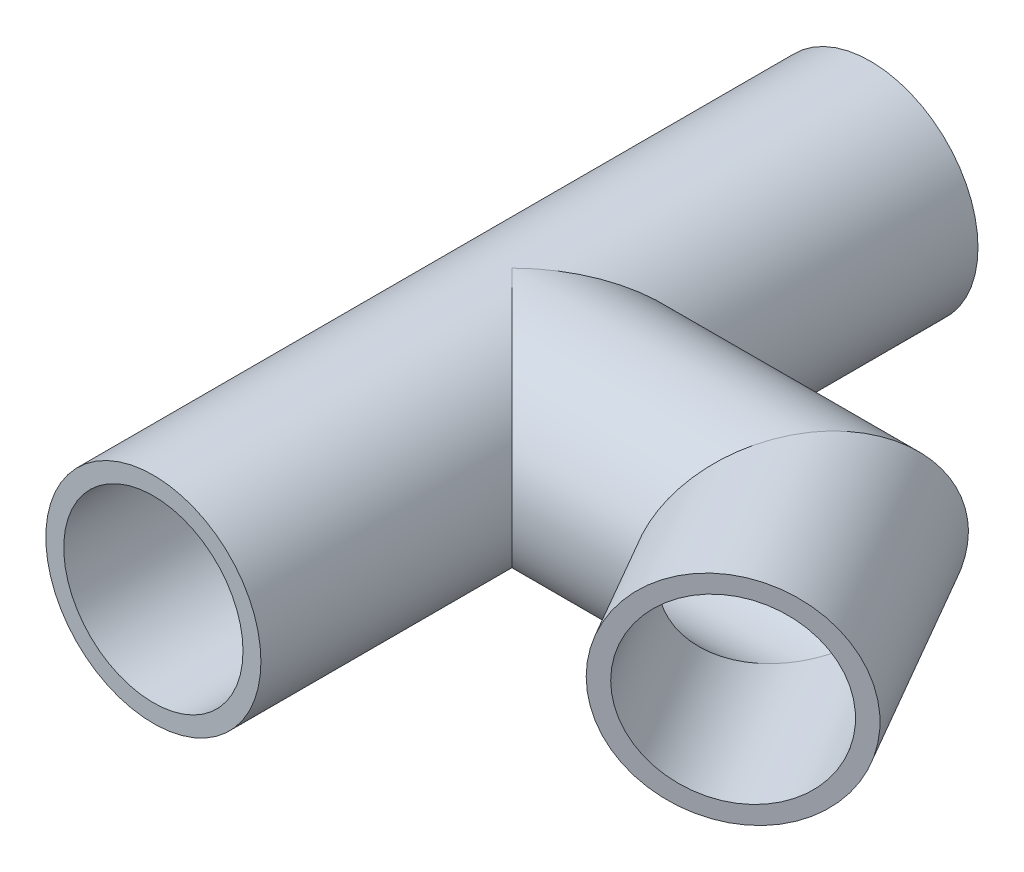
ISO-10303-21;
HEADER;
FILE_DESCRIPTION(('STEP AP214'),'2;1');
FILE_NAME('part.step','',(''),(''),'','','');
FILE_SCHEMA(('AUTOMOTIVE_DESIGN { 1 0 10303 214 1 1 1 1 }'));
ENDSEC;
DATA;
#1=APPLICATION_CONTEXT('core data for automotive mechanical design processes');
#2=APPLICATION_PROTOCOL_DEFINITION('international standard','automotive_design',2000,#1);
#3=PRODUCT_CONTEXT('',#1,'mechanical');
#4=PRODUCT('Part','Part','',(#3));
#5=PRODUCT_RELATED_PRODUCT_CATEGORY('part','',(#4));
#6=PRODUCT_DEFINITION_FORMATION('','',#4);
#7=PRODUCT_DEFINITION_CONTEXT('part definition',#1,'design');
#8=PRODUCT_DEFINITION('design','',#6,#7);
#9=PRODUCT_DEFINITION_SHAPE('','',#8);
#10=(LENGTH_UNIT() NAMED_UNIT(*) SI_UNIT(.MILLI.,.METRE.));
#11=(NAMED_UNIT(*) PLANE_ANGLE_UNIT() SI_UNIT($,.RADIAN.));
#12=(NAMED_UNIT(*) SI_UNIT($,.STERADIAN.) SOLID_ANGLE_UNIT());
#13=UNCERTAINTY_MEASURE_WITH_UNIT(LENGTH_MEASURE(1.E-05),#10,'distance_accuracy_value','');
#14=(GEOMETRIC_REPRESENTATION_CONTEXT(3) GLOBAL_UNCERTAINTY_ASSIGNED_CONTEXT((#13)) GLOBAL_UNIT_ASSIGNED_CONTEXT((#10,
#11,#12)) REPRESENTATION_CONTEXT('',''));
#15=CARTESIAN_POINT('',(0.,0.,0.));
#16=DIRECTION('',(0.,0.,1.));
#17=DIRECTION('',(1.,0.,0.));
#18=AXIS2_PLACEMENT_3D('',#15,#16,#17);
#19=CARTESIAN_POINT('',(0.,0.,20.));
#20=DIRECTION('',(0.,0.,-1.));
#21=DIRECTION('',(-1.,0.,0.));
#22=AXIS2_PLACEMENT_3D('',#19,#20,#21);
#23=CYLINDRICAL_SURFACE('',#22,3.);
#24=CARTESIAN_POINT('',(0.,0.,10.));
#25=DIRECTION('',(-0.707106781186547,0.,0.707106781186547));
#26=DIRECTION('',(-0.707106781186547,0.,-0.707106781186547));
#27=AXIS2_PLACEMENT_3D('',#24,#25,#26);
#28=ELLIPSE('',#27,4.24264068711929,3.);
#29=CARTESIAN_POINT('',(0.,3.,10.));
#30=VERTEX_POINT('',#29);
#31=CARTESIAN_POINT('',(0.,-3.,10.));
#32=VERTEX_POINT('',#31);
#33=EDGE_CURVE('E50',#30,#32,#28,.F.);
#34=ORIENTED_EDGE('',*,*,#33,.F.);
#35=CARTESIAN_POINT('',(0.,0.,10.));
#36=DIRECTION('',(-0.707106781186547,0.,-0.707106781186547));
#37=DIRECTION('',(-0.707106781186547,0.,0.707106781186547));
#38=AXIS2_PLACEMENT_3D('',#35,#36,#37);
#39=ELLIPSE('',#38,4.24264068711929,3.);
#40=EDGE_CURVE('E46',#32,#30,#39,.F.);
#41=ORIENTED_EDGE('',*,*,#40,.F.);
#42=EDGE_LOOP('',(#34,#41));
#43=FACE_BOUND('',#42,.T.);
#44=CARTESIAN_POINT('',(0.,0.,20.));
#45=DIRECTION('',(0.,0.,1.));
#46=DIRECTION('',(1.,0.,0.));
#47=AXIS2_PLACEMENT_3D('',#44,#45,#46);
#48=CIRCLE('',#47,3.);
#49=CARTESIAN_POINT('',(3.,0.,20.));
#50=VERTEX_POINT('',#49);
#51=EDGE_CURVE('E11',#50,#50,#48,.T.);
#52=ORIENTED_EDGE('',*,*,#51,.F.);
#53=EDGE_LOOP('',(#52));
#54=FACE_BOUND('',#53,.T.);
#55=CARTESIAN_POINT('',(0.,0.,0.));
#56=DIRECTION('',(0.,0.,1.));
#57=DIRECTION('',(1.,0.,0.));
#58=AXIS2_PLACEMENT_3D('',#55,#56,#57);
#59=CIRCLE('',#58,3.);
#60=CARTESIAN_POINT('',(3.,0.,0.));
#61=VERTEX_POINT('',#60);
#62=EDGE_CURVE('E36',#61,#61,#59,.T.);
#63=ORIENTED_EDGE('',*,*,#62,.T.);
#64=EDGE_LOOP('',(#63));
#65=FACE_BOUND('',#64,.T.);
#66=ADVANCED_FACE('F32',(#43,#54,#65),#23,.T.);
#67=CARTESIAN_POINT('',(0.,0.,20.));
#68=DIRECTION('',(0.,0.,1.));
#69=DIRECTION('',(1.,0.,0.));
#70=AXIS2_PLACEMENT_3D('',#67,#68,#69);
#71=PLANE('',#70);
#72=ORIENTED_EDGE('',*,*,#51,.T.);
#73=EDGE_LOOP('',(#72));
#74=FACE_BOUND('',#73,.T.);
#75=CARTESIAN_POINT('',(0.,0.,20.));
#76=DIRECTION('',(0.,0.,1.));
#77=DIRECTION('',(1.,0.,0.));
#78=AXIS2_PLACEMENT_3D('',#75,#76,#77);
#79=CIRCLE('',#78,2.5);
#80=CARTESIAN_POINT('',(2.5,0.,20.));
#81=VERTEX_POINT('',#80);
#82=EDGE_CURVE('E71',#81,#81,#79,.T.);
#83=ORIENTED_EDGE('',*,*,#82,.F.);
#84=EDGE_LOOP('',(#83));
#85=FACE_BOUND('',#84,.T.);
#86=ADVANCED_FACE('F118',(#74,#85),#71,.T.);
#87=CARTESIAN_POINT('',(0.,0.,0.));
#88=DIRECTION('',(0.,0.,1.));
#89=DIRECTION('',(1.,0.,0.));
#90=AXIS2_PLACEMENT_3D('',#87,#88,#89);
#91=PLANE('',#90);
#92=ORIENTED_EDGE('',*,*,#62,.F.);
#93=EDGE_LOOP('',(#92));
#94=FACE_BOUND('',#93,.T.);
#95=CARTESIAN_POINT('',(0.,0.,0.));
#96=DIRECTION('',(0.,0.,1.));
#97=DIRECTION('',(1.,0.,0.));
#98=AXIS2_PLACEMENT_3D('',#95,#96,#97);
#99=CIRCLE('',#98,2.5);
#100=CARTESIAN_POINT('',(2.5,0.,0.));
#101=VERTEX_POINT('',#100);
#102=EDGE_CURVE('E67',#101,#101,#99,.T.);
#103=ORIENTED_EDGE('',*,*,#102,.T.);
#104=EDGE_LOOP('',(#103));
#105=FACE_BOUND('',#104,.T.);
#106=ADVANCED_FACE('F123',(#94,#105),#91,.F.);
#107=CARTESIAN_POINT('',(0.,0.,20.));
#108=DIRECTION('',(0.,0.,-1.));
#109=DIRECTION('',(-1.,0.,0.));
#110=AXIS2_PLACEMENT_3D('',#107,#108,#109);
#111=CYLINDRICAL_SURFACE('',#110,2.5);
#112=ORIENTED_EDGE('',*,*,#82,.T.);
#113=EDGE_LOOP('',(#112));
#114=FACE_BOUND('',#113,.T.);
#115=ORIENTED_EDGE('',*,*,#102,.F.);
#116=EDGE_LOOP('',(#115));
#117=FACE_BOUND('',#116,.T.);
#118=ADVANCED_FACE('F101',(#114,#117),#111,.F.);
#119=CARTESIAN_POINT('',(10.0052558883258,0.,10.));
#120=DIRECTION('',(-1.,0.,0.));
#121=DIRECTION('',(0.,0.,1.));
#122=AXIS2_PLACEMENT_3D('',#119,#120,#121);
#123=CYLINDRICAL_SURFACE('',#122,3.);
#124=CARTESIAN_POINT('',(8.,0.,10.));
#125=DIRECTION('',(-0.866025403784438,0.,-0.500000000000001));
#126=DIRECTION('',(0.500000000000001,0.,-0.866025403784438));
#127=AXIS2_PLACEMENT_3D('',#124,#125,#126);
#128=ELLIPSE('',#127,3.46410161513776,3.);
#129=CARTESIAN_POINT('',(9.73205080756888,0.,7.));
#130=VERTEX_POINT('',#129);
#131=EDGE_CURVE('E74',#130,#130,#128,.F.);
#132=ORIENTED_EDGE('',*,*,#131,.F.);
#133=EDGE_LOOP('',(#132));
#134=FACE_BOUND('',#133,.T.);
#135=ORIENTED_EDGE('',*,*,#33,.T.);
#136=ORIENTED_EDGE('',*,*,#40,.T.);
#137=EDGE_LOOP('',(#135,#136));
#138=FACE_BOUND('',#137,.T.);
#139=ADVANCED_FACE('F97',(#134,#138),#123,.T.);
#140=CARTESIAN_POINT('',(9.68771324027147,0.,10.));
#141=DIRECTION('',(-1.,0.,0.));
#142=DIRECTION('',(0.,0.,1.));
#143=AXIS2_PLACEMENT_3D('',#140,#141,#142);
#144=CYLINDRICAL_SURFACE('',#143,2.5);
#145=CARTESIAN_POINT('',(8.,0.,10.));
#146=DIRECTION('',(-0.866025403784438,0.,-0.500000000000001));
#147=DIRECTION('',(0.500000000000001,0.,-0.866025403784438));
#148=AXIS2_PLACEMENT_3D('',#145,#146,#147);
#149=ELLIPSE('',#148,2.88675134594813,2.5);
#150=CARTESIAN_POINT('',(9.44337567297407,0.,7.5));
#151=VERTEX_POINT('',#150);
#152=EDGE_CURVE('E63',#151,#151,#149,.T.);
#153=ORIENTED_EDGE('',*,*,#152,.F.);
#154=EDGE_LOOP('',(#153));
#155=FACE_BOUND('',#154,.T.);
#156=CARTESIAN_POINT('',(3.,0.,12.5));
#157=CARTESIAN_POINT('',(2.99999522795205,0.118757533193203,12.4999951144463));
#158=CARTESIAN_POINT('',(2.99288670594743,0.237551281104127,12.4914774960954));
#159=CARTESIAN_POINT('',(2.96510762868268,0.47118249249281,12.4580372766482));
#160=CARTESIAN_POINT('',(2.94442702942007,0.586016959612417,12.4331025260247));
#161=CARTESIAN_POINT('',(2.89142690238865,0.807829942407297,12.3686878826673));
#162=CARTESIAN_POINT('',(2.8591769655007,0.914850920904901,12.3292949256463));
#163=CARTESIAN_POINT('',(2.78529176182903,1.11984139043408,12.2379829520574));
#164=CARTESIAN_POINT('',(2.74365332434937,1.21780780775233,12.1860597033267));
#165=CARTESIAN_POINT('',(2.63674191529867,1.43789998519767,12.0505462501918));
#166=CARTESIAN_POINT('',(2.56840549256191,1.5556821965722,11.9623297958178));
#167=CARTESIAN_POINT('',(2.42422624777674,1.77202398328147,11.7694756742486));
#168=CARTESIAN_POINT('',(2.34836281453276,1.87052845158605,11.6647924307569));
#169=CARTESIAN_POINT('',(2.23294886313738,2.00437263805589,11.4959157235089));
#170=CARTESIAN_POINT('',(2.19383679994997,2.04699726278816,11.4370444238087));
#171=CARTESIAN_POINT('',(2.11620611809193,2.12715295529554,11.3154943970395));
#172=CARTESIAN_POINT('',(2.07768770195023,2.16468231743739,11.2528144051293));
#173=CARTESIAN_POINT('',(2.00250543288661,2.23441122570746,11.1237326756644));
#174=CARTESIAN_POINT('',(1.96583735754651,2.26662332666227,11.0573402152752));
#175=CARTESIAN_POINT('',(1.89577686630311,2.32553690612792,10.9205537160716));
#176=CARTESIAN_POINT('',(1.86238167220904,2.3522430799868,10.8501631526582));
#177=CARTESIAN_POINT('',(1.79791918980412,2.40193513934005,10.6983329097999));
#178=CARTESIAN_POINT('',(1.76736311251003,2.42433807692598,10.6164759072765));
#179=CARTESIAN_POINT('',(1.71593180556004,2.46101313675502,10.4481102311869));
#180=CARTESIAN_POINT('',(1.69503310194197,2.47530499393792,10.3616134133853));
#181=CARTESIAN_POINT('',(1.66620928968844,2.49481072799048,10.1842345916205));
#182=CARTESIAN_POINT('',(1.65844510563093,2.49991205058667,10.0933120409293));
#183=CARTESIAN_POINT('',(1.65818308531825,2.5000856937119,9.91143738699724));
#184=CARTESIAN_POINT('',(1.6656854491694,2.49515788278405,9.82048528338466));
#185=CARTESIAN_POINT('',(1.69541639464497,2.47505262029594,9.63447528917288));
#186=CARTESIAN_POINT('',(1.71881932066467,2.45905577113332,9.53970625428293));
#187=CARTESIAN_POINT('',(1.77688235738914,2.41742550503027,9.35578901879782));
#188=CARTESIAN_POINT('',(1.81157977103025,2.39176011044289,9.26666062928517));
#189=CARTESIAN_POINT('',(1.88002226126137,2.33816270346873,9.1121729214589));
#190=CARTESIAN_POINT('',(1.91250316845439,2.31177513033566,9.04568775758835));
#191=CARTESIAN_POINT('',(1.9802199666153,2.25404424958636,8.91634919322007));
#192=CARTESIAN_POINT('',(2.01545746697786,2.22269803586306,8.85349795213416));
#193=CARTESIAN_POINT('',(2.12342648109725,2.12149677560466,8.67003315898033));
#194=CARTESIAN_POINT('',(2.19837696967438,2.04450664231777,8.55458585239391));
#195=CARTESIAN_POINT('',(2.35079897952278,1.86765914501414,8.33173303754565));
#196=CARTESIAN_POINT('',(2.42819792618945,1.76681805277628,8.22506167600811));
#197=CARTESIAN_POINT('',(2.57509054043285,1.54484388336148,8.0288876551826));
#198=CARTESIAN_POINT('',(2.64460112267364,1.42375565615773,7.93934796694374));
#199=CARTESIAN_POINT('',(2.75428914126548,1.19411179169415,7.80058516090145));
#200=CARTESIAN_POINT('',(2.79748350073996,1.08972732107276,7.74685710181235));
#201=CARTESIAN_POINT('',(2.87307804019801,0.871071458330362,7.65365725474466));
#202=CARTESIAN_POINT('',(2.90548495660805,0.756806292780758,7.61417656841942));
#203=CARTESIAN_POINT('',(2.95709834265565,0.519954301215414,7.55158275006779));
#204=CARTESIAN_POINT('',(2.97620280955844,0.397310923125304,7.52859605334244));
#205=CARTESIAN_POINT('',(2.99891434528972,0.148559976923723,7.50129076807281));
#206=CARTESIAN_POINT('',(3.00253178304177,0.0224547835239977,7.49695968914984));
#207=CARTESIAN_POINT('',(2.99444999039147,-0.213310199456579,7.50666243944376));
#208=CARTESIAN_POINT('',(2.98453350716313,-0.323130540835863,7.51855863871517));
#209=CARTESIAN_POINT('',(2.95325589460135,-0.538644964400608,7.55626695021149));
#210=CARTESIAN_POINT('',(2.93189339242796,-0.644338549989565,7.58208073171896));
#211=CARTESIAN_POINT('',(2.87889521546186,-0.85056549919926,7.64662339545526));
#212=CARTESIAN_POINT('',(2.84712564891974,-0.95101068222332,7.68552078944427));
#213=CARTESIAN_POINT('',(2.77536124733889,-1.14365900898104,7.7743956323367));
#214=CARTESIAN_POINT('',(2.73536337221808,-1.2358590883121,7.82437717699329));
#215=CARTESIAN_POINT('',(2.62975152158594,-1.450674397351,7.95843179534697));
#216=CARTESIAN_POINT('',(2.56070244234714,-1.56834359540731,8.0477325832673));
#217=CARTESIAN_POINT('',(2.4152244540319,-1.78428994740848,8.24284038265563));
#218=CARTESIAN_POINT('',(2.33877300422834,-1.88250490855173,8.34869845535474));
#219=CARTESIAN_POINT('',(2.222698055986,-2.01573314784291,8.51941196792862));
#220=CARTESIAN_POINT('',(2.1834115173603,-2.05811069143949,8.57889827297599));
#221=CARTESIAN_POINT('',(2.10553153817181,-2.13771669597406,8.70172081603228));
#222=CARTESIAN_POINT('',(2.06693835133607,-2.17494330406755,8.7650584276641));
#223=CARTESIAN_POINT('',(1.99176108482639,-2.24398857026757,8.89548840391519));
#224=CARTESIAN_POINT('',(1.95517188634212,-2.27582148781538,8.96257022453361));
#225=CARTESIAN_POINT('',(1.88547561448179,-2.3338885673946,9.10079010449983));
#226=CARTESIAN_POINT('',(1.8523653645079,-2.36012785984655,9.17192437041937));
#227=CARTESIAN_POINT('',(1.78925557416047,-2.40837357148322,9.32427036835189));
#228=CARTESIAN_POINT('',(1.75970711786653,-2.42988314318545,9.40583445107373));
#229=CARTESIAN_POINT('',(1.71043063887427,-2.46482255689514,9.57345195394261));
#230=CARTESIAN_POINT('',(1.69067811225259,-2.47827257713357,9.65949357132788));
#231=CARTESIAN_POINT('',(1.6641531597946,-2.49617289535263,9.83563760741234));
#232=CARTESIAN_POINT('',(1.65753251048391,-2.5005179918396,9.92577532975069));
#233=CARTESIAN_POINT('',(1.65924308630667,-2.49938197104455,10.1058532127839));
#234=CARTESIAN_POINT('',(1.66757825402155,-2.49389826274012,10.1957933151251));
#235=CARTESIAN_POINT('',(1.69892898735519,-2.4726526384854,10.3816725753905));
#236=CARTESIAN_POINT('',(1.72341371023858,-2.45585812550761,10.4772302705327));
#237=CARTESIAN_POINT('',(1.78358728037387,-2.41250339675091,10.6625312960827));
#238=CARTESIAN_POINT('',(1.81931312531326,-2.38591088285909,10.7522542287093));
#239=CARTESIAN_POINT('',(1.88952619366194,-2.33050835844918,10.9077890413548));
#240=CARTESIAN_POINT('',(1.92277816627791,-2.30325853049531,10.9747437592349));
#241=CARTESIAN_POINT('',(1.99195185230571,-2.24370627018012,11.1049463864244));
#242=CARTESIAN_POINT('',(2.0278751115052,-2.21140090020863,11.1681921109998));
#243=CARTESIAN_POINT('',(2.13775931167913,-2.10716294428985,11.352729561342));
#244=CARTESIAN_POINT('',(2.21379780164321,-2.02793576743751,11.4687469249919));
#245=CARTESIAN_POINT('',(2.36772603763547,-1.84629697567413,11.6920072612913));
#246=CARTESIAN_POINT('',(2.44552394429513,-1.7429395959328,11.7985417940329));
#247=CARTESIAN_POINT('',(2.59256498427755,-1.5155355493562,11.9938637995393));
#248=CARTESIAN_POINT('',(2.66182692543068,-1.39153583663214,12.082690565874));
#249=CARTESIAN_POINT('',(2.76942305781509,-1.15855518141082,12.2183141967231));
#250=CARTESIAN_POINT('',(2.81112174006883,-1.05399877947692,12.2700385102194));
#251=CARTESIAN_POINT('',(2.88361460666453,-0.835439786054347,12.3592186702386));
#252=CARTESIAN_POINT('',(2.9144233132377,-0.721450026753892,12.3966935240953));
#253=CARTESIAN_POINT('',(2.95858745904691,-0.506620038886847,12.4501884558266));
#254=CARTESIAN_POINT('',(2.97402142398111,-0.406845468761914,12.4687751222268));
#255=CARTESIAN_POINT('',(2.99472922794408,-0.204722725654231,12.4936823682381));
#256=CARTESIAN_POINT('',(3.00000411373941,-0.102374818922781,12.5000042115869));
#257=CARTESIAN_POINT('',(3.,0.,12.5));
#258=B_SPLINE_CURVE_WITH_KNOTS('',3,(#156,#157,#158,#159,#160,#161,#162,#163,#164,#165,#166,
#167,#168,#169,#170,#171,#172,#173,#174,#175,#176,#177,#178,#179,#180,#181,#182,#183,#184,#185,
#186,#187,#188,#189,#190,#191,#192,#193,#194,#195,#196,#197,#198,#199,#200,#201,#202,#203,#204,
#205,#206,#207,#208,#209,#210,#211,#212,#213,#214,#215,#216,#217,#218,#219,#220,#221,#222,#223,
#224,#225,#226,#227,#228,#229,#230,#231,#232,#233,#234,#235,#236,#237,#238,#239,#240,#241,#242,
#243,#244,#245,#246,#247,#248,#249,#250,#251,#252,#253,#254,#255,#256,#257),.UNSPECIFIED.,.T.,
.F.,(4,2,2,2,2,2,2,2,2,2,2,2,2,2,2,2,2,2,2,2,2,2,2,2,2,2,2,2,2,2,2,2,2,2,2,2,2,2,2,2,2,2,2,2,2,
2,2,2,2,2,4),(0.,0.355841276815113,0.711946191026961,1.06594405359551,1.42006164830116,
1.90425178760126,2.38980643116775,2.63722280423449,2.88472179650724,3.13162777943676,
3.37832232674674,3.64812890035754,3.91727616616869,4.18969776924975,4.46212294312047,
4.75723524199722,5.05333228584568,5.28870178855694,5.52420974868633,5.99549339358981,
6.49137310548272,6.98616858956868,7.36002155957576,7.73364063000476,8.11009395319721,
8.48629519274361,8.81743460677927,9.14861374669872,9.48423297747607,9.81997643164434,
10.3065635514456,10.7946819775667,11.0432812121088,11.2919696391639,11.5399899810636,
11.787781852862,12.0551105531685,12.3217671309317,12.5914881373799,12.8612802568452,
13.1598101383752,13.4593330283462,13.6977271411687,13.9362602949129,14.4135864576438,
14.914300110886,15.413889999571,15.7841228897599,16.1538601797496,16.4606444271243,
16.7673970625124),.UNSPECIFIED.);
#259=CARTESIAN_POINT('',(3.,0.,12.5));
#260=VERTEX_POINT('',#259);
#261=EDGE_CURVE('E81',#260,#260,#258,.T.);
#262=ORIENTED_EDGE('',*,*,#261,.T.);
#263=EDGE_LOOP('',(#262));
#264=FACE_BOUND('',#263,.T.);
#265=ADVANCED_FACE('F64',(#155,#264),#144,.F.);
#266=CARTESIAN_POINT('',(10.5,0.,14.3301270189222));
#267=DIRECTION('',(-0.499999999999999,0.,-0.866025403784439));
#268=DIRECTION('',(-0.86602540378444,0.,0.499999999999999));
#269=AXIS2_PLACEMENT_3D('',#266,#267,#268);
#270=CYLINDRICAL_SURFACE('',#269,3.);
#271=CARTESIAN_POINT('',(10.5,0.,14.3301270189222));
#272=DIRECTION('',(-0.499999999999999,0.,-0.866025403784439));
#273=DIRECTION('',(-0.866025403784439,0.,0.499999999999999));
#274=AXIS2_PLACEMENT_3D('',#271,#272,#273);
#275=CIRCLE('',#274,3.);
#276=CARTESIAN_POINT('',(7.90192378864668,0.,15.8301270189222));
#277=VERTEX_POINT('',#276);
#278=EDGE_CURVE('E77',#277,#277,#275,.T.);
#279=ORIENTED_EDGE('',*,*,#278,.T.);
#280=EDGE_LOOP('',(#279));
#281=FACE_BOUND('',#280,.T.);
#282=ORIENTED_EDGE('',*,*,#131,.T.);
#283=EDGE_LOOP('',(#282));
#284=FACE_BOUND('',#283,.T.);
#285=ADVANCED_FACE('F96',(#281,#284),#270,.T.);
#286=CARTESIAN_POINT('',(10.5,0.,14.3301270189222));
#287=DIRECTION('',(-0.499999999999999,0.,-0.866025403784439));
#288=DIRECTION('',(-0.866025403784439,0.,0.499999999999999));
#289=AXIS2_PLACEMENT_3D('',#286,#287,#288);
#290=PLANE('',#289);
#291=CARTESIAN_POINT('',(10.5,0.,14.3301270189222));
#292=DIRECTION('',(-0.499999999999999,0.,-0.866025403784439));
#293=DIRECTION('',(-0.866025403784439,0.,0.499999999999999));
#294=AXIS2_PLACEMENT_3D('',#291,#292,#293);
#295=CIRCLE('',#294,2.5);
#296=CARTESIAN_POINT('',(8.3349364905389,0.,15.5801270189222));
#297=VERTEX_POINT('',#296);
#298=EDGE_CURVE('E68',#297,#297,#295,.F.);
#299=ORIENTED_EDGE('',*,*,#298,.F.);
#300=EDGE_LOOP('',(#299));
#301=FACE_BOUND('',#300,.T.);
#302=ORIENTED_EDGE('',*,*,#278,.F.);
#303=EDGE_LOOP('',(#302));
#304=FACE_BOUND('',#303,.T.);
#305=ADVANCED_FACE('F105',(#301,#304),#290,.F.);
#306=CARTESIAN_POINT('',(10.5,0.,14.3301270189222));
#307=DIRECTION('',(-0.499999999999999,0.,-0.866025403784439));
#308=DIRECTION('',(-0.86602540378444,0.,0.499999999999999));
#309=AXIS2_PLACEMENT_3D('',#306,#307,#308);
#310=CYLINDRICAL_SURFACE('',#309,2.5);
#311=ORIENTED_EDGE('',*,*,#298,.T.);
#312=EDGE_LOOP('',(#311));
#313=FACE_BOUND('',#312,.T.);
#314=ORIENTED_EDGE('',*,*,#152,.T.);
#315=EDGE_LOOP('',(#314));
#316=FACE_BOUND('',#315,.T.);
#317=ADVANCED_FACE('F98',(#313,#316),#310,.F.);
#318=ORIENTED_EDGE('',*,*,#261,.F.);
#319=EDGE_LOOP('',(#318));
#320=FACE_BOUND('',#319,.T.);
#321=ADVANCED_FACE('F34',(#320),#23,.T.);
#322=CLOSED_SHELL('',(#66,#86,#106,#118,#139,#265,#285,#305,#317,#321));
#323=MANIFOLD_SOLID_BREP('B2',#322);
#324=ADVANCED_BREP_SHAPE_REPRESENTATION('',(#18,#323),#14);
#325=SHAPE_DEFINITION_REPRESENTATION(#9,#324);
ENDSEC;
END-ISO-10303-21;
